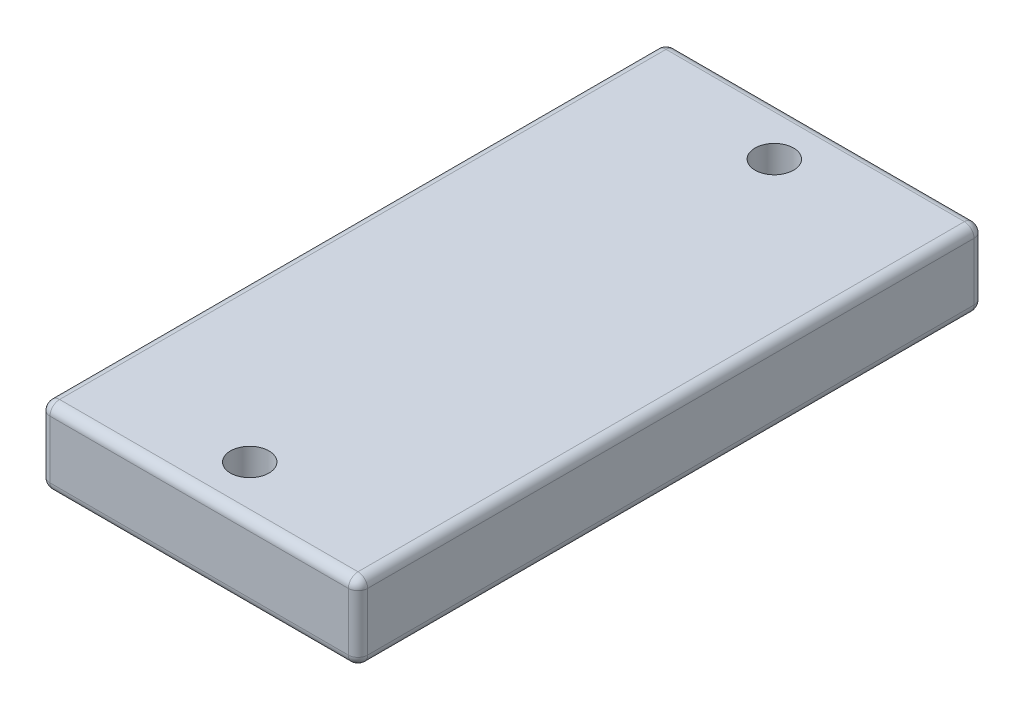
ISO-10303-21;
HEADER;
FILE_DESCRIPTION(('STEP AP214'),'2;1');
FILE_NAME('part.step','',(''),(''),'','','');
FILE_SCHEMA(('AUTOMOTIVE_DESIGN { 1 0 10303 214 1 1 1 1 }'));
ENDSEC;
DATA;
#1=APPLICATION_CONTEXT('core data for automotive mechanical design processes');
#2=APPLICATION_PROTOCOL_DEFINITION('international standard','automotive_design',2000,#1);
#3=PRODUCT_CONTEXT('',#1,'mechanical');
#4=PRODUCT('Part','Part','',(#3));
#5=PRODUCT_RELATED_PRODUCT_CATEGORY('part','',(#4));
#6=PRODUCT_DEFINITION_FORMATION('','',#4);
#7=PRODUCT_DEFINITION_CONTEXT('part definition',#1,'design');
#8=PRODUCT_DEFINITION('design','',#6,#7);
#9=PRODUCT_DEFINITION_SHAPE('','',#8);
#10=(LENGTH_UNIT() NAMED_UNIT(*) SI_UNIT(.MILLI.,.METRE.));
#11=(NAMED_UNIT(*) PLANE_ANGLE_UNIT() SI_UNIT($,.RADIAN.));
#12=(NAMED_UNIT(*) SI_UNIT($,.STERADIAN.) SOLID_ANGLE_UNIT());
#13=UNCERTAINTY_MEASURE_WITH_UNIT(LENGTH_MEASURE(1.E-05),#10,'distance_accuracy_value','');
#14=(GEOMETRIC_REPRESENTATION_CONTEXT(3) GLOBAL_UNCERTAINTY_ASSIGNED_CONTEXT((#13)) GLOBAL_UNIT_ASSIGNED_CONTEXT((#10,
#11,#12)) REPRESENTATION_CONTEXT('',''));
#15=CARTESIAN_POINT('',(0.,0.,0.));
#16=DIRECTION('',(0.,0.,1.));
#17=DIRECTION('',(1.,0.,0.));
#18=AXIS2_PLACEMENT_3D('',#15,#16,#17);
#19=CARTESIAN_POINT('',(0.,8.,0.));
#20=DIRECTION('',(1.,0.,0.));
#21=DIRECTION('',(0.,0.,-1.));
#22=AXIS2_PLACEMENT_3D('',#19,#20,#21);
#23=PLANE('',#22);
#24=DIRECTION('',(0.,-1.,0.));
#25=VECTOR('',#24,1.);
#26=CARTESIAN_POINT('',(0.,8.,-64.));
#27=LINE('',#26,#25);
#28=CARTESIAN_POINT('',(0.,7.,-64.));
#29=VERTEX_POINT('',#28);
#30=CARTESIAN_POINT('',(0.,1.,-64.));
#31=VERTEX_POINT('',#30);
#32=EDGE_CURVE('E132',#29,#31,#27,.T.);
#33=ORIENTED_EDGE('',*,*,#32,.T.);
#34=DIRECTION('',(0.,0.,1.));
#35=VECTOR('',#34,1.);
#36=CARTESIAN_POINT('',(0.,1.,0.));
#37=LINE('',#36,#35);
#38=CARTESIAN_POINT('',(0.,1.,-1.));
#39=VERTEX_POINT('',#38);
#40=EDGE_CURVE('E128',#31,#39,#37,.T.);
#41=ORIENTED_EDGE('',*,*,#40,.T.);
#42=DIRECTION('',(0.,-1.,0.));
#43=VECTOR('',#42,1.);
#44=CARTESIAN_POINT('',(0.,8.,-1.));
#45=LINE('',#44,#43);
#46=CARTESIAN_POINT('',(0.,7.,-1.));
#47=VERTEX_POINT('',#46);
#48=EDGE_CURVE('E121',#39,#47,#45,.F.);
#49=ORIENTED_EDGE('',*,*,#48,.T.);
#50=DIRECTION('',(0.,0.,1.));
#51=VECTOR('',#50,1.);
#52=CARTESIAN_POINT('',(0.,7.,0.));
#53=LINE('',#52,#51);
#54=EDGE_CURVE('E125',#47,#29,#53,.F.);
#55=ORIENTED_EDGE('',*,*,#54,.T.);
#56=EDGE_LOOP('',(#33,#41,#49,#55));
#57=FACE_BOUND('',#56,.T.);
#58=ADVANCED_FACE('F33',(#57),#23,.F.);
#59=CARTESIAN_POINT('',(0.,8.,0.));
#60=DIRECTION('',(0.,0.,-1.));
#61=DIRECTION('',(-1.,0.,0.));
#62=AXIS2_PLACEMENT_3D('',#59,#60,#61);
#63=PLANE('',#62);
#64=DIRECTION('',(0.,-1.,0.));
#65=VECTOR('',#64,1.);
#66=CARTESIAN_POINT('',(1.,8.,0.));
#67=LINE('',#66,#65);
#68=CARTESIAN_POINT('',(1.,7.,0.));
#69=VERTEX_POINT('',#68);
#70=CARTESIAN_POINT('',(1.,1.,0.));
#71=VERTEX_POINT('',#70);
#72=EDGE_CURVE('E140',#69,#71,#67,.T.);
#73=ORIENTED_EDGE('',*,*,#72,.T.);
#74=DIRECTION('',(1.,0.,0.));
#75=VECTOR('',#74,1.);
#76=CARTESIAN_POINT('',(33.,1.,0.));
#77=LINE('',#76,#75);
#78=CARTESIAN_POINT('',(32.,1.,0.));
#79=VERTEX_POINT('',#78);
#80=EDGE_CURVE('E190',#71,#79,#77,.T.);
#81=ORIENTED_EDGE('',*,*,#80,.T.);
#82=DIRECTION('',(0.,-1.,0.));
#83=VECTOR('',#82,1.);
#84=CARTESIAN_POINT('',(32.,8.,0.));
#85=LINE('',#84,#83);
#86=CARTESIAN_POINT('',(32.,7.,0.));
#87=VERTEX_POINT('',#86);
#88=EDGE_CURVE('E187',#79,#87,#85,.F.);
#89=ORIENTED_EDGE('',*,*,#88,.T.);
#90=DIRECTION('',(1.,0.,0.));
#91=VECTOR('',#90,1.);
#92=CARTESIAN_POINT('',(0.,7.,0.));
#93=LINE('',#92,#91);
#94=EDGE_CURVE('E185',#87,#69,#93,.F.);
#95=ORIENTED_EDGE('',*,*,#94,.T.);
#96=EDGE_LOOP('',(#73,#81,#89,#95));
#97=FACE_BOUND('',#96,.T.);
#98=ADVANCED_FACE('F297',(#97),#63,.F.);
#99=CARTESIAN_POINT('',(33.,8.,0.));
#100=DIRECTION('',(-1.,0.,0.));
#101=DIRECTION('',(0.,0.,1.));
#102=AXIS2_PLACEMENT_3D('',#99,#100,#101);
#103=PLANE('',#102);
#104=DIRECTION('',(0.,-1.,0.));
#105=VECTOR('',#104,1.);
#106=CARTESIAN_POINT('',(33.,8.,-1.));
#107=LINE('',#106,#105);
#108=CARTESIAN_POINT('',(33.,7.,-1.));
#109=VERTEX_POINT('',#108);
#110=CARTESIAN_POINT('',(33.,1.,-1.));
#111=VERTEX_POINT('',#110);
#112=EDGE_CURVE('E178',#109,#111,#107,.T.);
#113=ORIENTED_EDGE('',*,*,#112,.T.);
#114=DIRECTION('',(0.,0.,-1.));
#115=VECTOR('',#114,1.);
#116=CARTESIAN_POINT('',(33.,1.,-65.));
#117=LINE('',#116,#115);
#118=CARTESIAN_POINT('',(33.,1.,-64.));
#119=VERTEX_POINT('',#118);
#120=EDGE_CURVE('E183',#111,#119,#117,.T.);
#121=ORIENTED_EDGE('',*,*,#120,.T.);
#122=DIRECTION('',(0.,-1.,0.));
#123=VECTOR('',#122,1.);
#124=CARTESIAN_POINT('',(33.,8.,-64.));
#125=LINE('',#124,#123);
#126=CARTESIAN_POINT('',(33.,7.,-64.));
#127=VERTEX_POINT('',#126);
#128=EDGE_CURVE('E180',#119,#127,#125,.F.);
#129=ORIENTED_EDGE('',*,*,#128,.T.);
#130=DIRECTION('',(0.,0.,-1.));
#131=VECTOR('',#130,1.);
#132=CARTESIAN_POINT('',(33.,7.,0.));
#133=LINE('',#132,#131);
#134=EDGE_CURVE('E176',#127,#109,#133,.F.);
#135=ORIENTED_EDGE('',*,*,#134,.T.);
#136=EDGE_LOOP('',(#113,#121,#129,#135));
#137=FACE_BOUND('',#136,.T.);
#138=ADVANCED_FACE('F276',(#137),#103,.F.);
#139=CARTESIAN_POINT('',(0.,8.,-65.));
#140=DIRECTION('',(0.,0.,1.));
#141=DIRECTION('',(1.,0.,0.));
#142=AXIS2_PLACEMENT_3D('',#139,#140,#141);
#143=PLANE('',#142);
#144=DIRECTION('',(0.,-1.,0.));
#145=VECTOR('',#144,1.);
#146=CARTESIAN_POINT('',(32.,8.,-65.));
#147=LINE('',#146,#145);
#148=CARTESIAN_POINT('',(32.,7.,-65.));
#149=VERTEX_POINT('',#148);
#150=CARTESIAN_POINT('',(32.,1.,-65.));
#151=VERTEX_POINT('',#150);
#152=EDGE_CURVE('E169',#149,#151,#147,.T.);
#153=ORIENTED_EDGE('',*,*,#152,.T.);
#154=DIRECTION('',(-1.,0.,0.));
#155=VECTOR('',#154,1.);
#156=CARTESIAN_POINT('',(0.,1.,-65.));
#157=LINE('',#156,#155);
#158=CARTESIAN_POINT('',(1.,1.,-65.));
#159=VERTEX_POINT('',#158);
#160=EDGE_CURVE('E174',#151,#159,#157,.T.);
#161=ORIENTED_EDGE('',*,*,#160,.T.);
#162=DIRECTION('',(0.,-1.,0.));
#163=VECTOR('',#162,1.);
#164=CARTESIAN_POINT('',(1.,8.,-65.));
#165=LINE('',#164,#163);
#166=CARTESIAN_POINT('',(1.,7.,-65.));
#167=VERTEX_POINT('',#166);
#168=EDGE_CURVE('E171',#159,#167,#165,.F.);
#169=ORIENTED_EDGE('',*,*,#168,.T.);
#170=DIRECTION('',(-1.,0.,0.));
#171=VECTOR('',#170,1.);
#172=CARTESIAN_POINT('',(0.,7.,-65.));
#173=LINE('',#172,#171);
#174=EDGE_CURVE('E167',#167,#149,#173,.F.);
#175=ORIENTED_EDGE('',*,*,#174,.T.);
#176=EDGE_LOOP('',(#153,#161,#169,#175));
#177=FACE_BOUND('',#176,.T.);
#178=ADVANCED_FACE('F304',(#177),#143,.F.);
#179=CARTESIAN_POINT('',(0.,8.,0.));
#180=DIRECTION('',(0.,-1.,0.));
#181=DIRECTION('',(0.,0.,-1.));
#182=AXIS2_PLACEMENT_3D('',#179,#180,#181);
#183=PLANE('',#182);
#184=CARTESIAN_POINT('',(16.5,8.,-5.24999999999999));
#185=DIRECTION('',(0.,1.,0.));
#186=DIRECTION('',(0.,0.,1.));
#187=AXIS2_PLACEMENT_3D('',#184,#185,#186);
#188=CIRCLE('',#187,2.);
#189=CARTESIAN_POINT('',(16.5,8.,-3.24999999999999));
#190=VERTEX_POINT('',#189);
#191=EDGE_CURVE('E435',#190,#190,#188,.T.);
#192=ORIENTED_EDGE('',*,*,#191,.F.);
#193=EDGE_LOOP('',(#192));
#194=FACE_BOUND('',#193,.T.);
#195=CARTESIAN_POINT('',(16.5,8.,-59.75));
#196=DIRECTION('',(0.,1.,0.));
#197=DIRECTION('',(0.,0.,1.));
#198=AXIS2_PLACEMENT_3D('',#195,#196,#197);
#199=CIRCLE('',#198,2.);
#200=CARTESIAN_POINT('',(16.5,8.,-57.75));
#201=VERTEX_POINT('',#200);
#202=EDGE_CURVE('E162',#201,#201,#199,.T.);
#203=ORIENTED_EDGE('',*,*,#202,.F.);
#204=EDGE_LOOP('',(#203));
#205=FACE_BOUND('',#204,.T.);
#206=DIRECTION('',(0.,0.,-1.));
#207=VECTOR('',#206,1.);
#208=CARTESIAN_POINT('',(32.,8.,0.));
#209=LINE('',#208,#207);
#210=CARTESIAN_POINT('',(32.,8.,-1.));
#211=VERTEX_POINT('',#210);
#212=CARTESIAN_POINT('',(32.,8.,-64.));
#213=VERTEX_POINT('',#212);
#214=EDGE_CURVE('E42',#211,#213,#209,.T.);
#215=ORIENTED_EDGE('',*,*,#214,.T.);
#216=DIRECTION('',(-1.,0.,0.));
#217=VECTOR('',#216,1.);
#218=CARTESIAN_POINT('',(0.,8.,-64.));
#219=LINE('',#218,#217);
#220=CARTESIAN_POINT('',(1.,8.,-64.));
#221=VERTEX_POINT('',#220);
#222=EDGE_CURVE('E11',#213,#221,#219,.T.);
#223=ORIENTED_EDGE('',*,*,#222,.T.);
#224=DIRECTION('',(0.,0.,1.));
#225=VECTOR('',#224,1.);
#226=CARTESIAN_POINT('',(1.,8.,0.));
#227=LINE('',#226,#225);
#228=CARTESIAN_POINT('',(1.,8.,-1.));
#229=VERTEX_POINT('',#228);
#230=EDGE_CURVE('E201',#221,#229,#227,.T.);
#231=ORIENTED_EDGE('',*,*,#230,.T.);
#232=DIRECTION('',(1.,0.,0.));
#233=VECTOR('',#232,1.);
#234=CARTESIAN_POINT('',(0.,8.,-1.));
#235=LINE('',#234,#233);
#236=EDGE_CURVE('E53',#229,#211,#235,.T.);
#237=ORIENTED_EDGE('',*,*,#236,.T.);
#238=EDGE_LOOP('',(#215,#223,#231,#237));
#239=FACE_BOUND('',#238,.T.);
#240=ADVANCED_FACE('F369',(#194,#205,#239),#183,.F.);
#241=CARTESIAN_POINT('',(0.,0.,0.));
#242=DIRECTION('',(0.,-1.,0.));
#243=DIRECTION('',(0.,0.,-1.));
#244=AXIS2_PLACEMENT_3D('',#241,#242,#243);
#245=PLANE('',#244);
#246=CARTESIAN_POINT('',(16.5,0.,-5.24999999999999));
#247=DIRECTION('',(0.,1.,0.));
#248=DIRECTION('',(0.,0.,1.));
#249=AXIS2_PLACEMENT_3D('',#246,#247,#248);
#250=CIRCLE('',#249,2.);
#251=CARTESIAN_POINT('',(16.5,0.,-3.24999999999999));
#252=VERTEX_POINT('',#251);
#253=EDGE_CURVE('E208',#252,#252,#250,.T.);
#254=ORIENTED_EDGE('',*,*,#253,.T.);
#255=EDGE_LOOP('',(#254));
#256=FACE_BOUND('',#255,.T.);
#257=CARTESIAN_POINT('',(16.5,0.,-59.75));
#258=DIRECTION('',(0.,1.,0.));
#259=DIRECTION('',(0.,0.,1.));
#260=AXIS2_PLACEMENT_3D('',#257,#258,#259);
#261=CIRCLE('',#260,2.);
#262=CARTESIAN_POINT('',(16.5,0.,-57.75));
#263=VERTEX_POINT('',#262);
#264=EDGE_CURVE('E436',#263,#263,#261,.T.);
#265=ORIENTED_EDGE('',*,*,#264,.T.);
#266=EDGE_LOOP('',(#265));
#267=FACE_BOUND('',#266,.T.);
#268=DIRECTION('',(0.,0.,-1.));
#269=VECTOR('',#268,1.);
#270=CARTESIAN_POINT('',(32.,0.,0.));
#271=LINE('',#270,#269);
#272=CARTESIAN_POINT('',(32.,0.,-64.));
#273=VERTEX_POINT('',#272);
#274=CARTESIAN_POINT('',(32.,0.,-1.));
#275=VERTEX_POINT('',#274);
#276=EDGE_CURVE('E196',#273,#275,#271,.F.);
#277=ORIENTED_EDGE('',*,*,#276,.T.);
#278=DIRECTION('',(1.,0.,0.));
#279=VECTOR('',#278,1.);
#280=CARTESIAN_POINT('',(0.,0.,-1.));
#281=LINE('',#280,#279);
#282=CARTESIAN_POINT('',(1.,0.,-1.));
#283=VERTEX_POINT('',#282);
#284=EDGE_CURVE('E198',#275,#283,#281,.F.);
#285=ORIENTED_EDGE('',*,*,#284,.T.);
#286=DIRECTION('',(0.,0.,1.));
#287=VECTOR('',#286,1.);
#288=CARTESIAN_POINT('',(1.,0.,-65.));
#289=LINE('',#288,#287);
#290=CARTESIAN_POINT('',(1.,0.,-64.));
#291=VERTEX_POINT('',#290);
#292=EDGE_CURVE('E192',#283,#291,#289,.F.);
#293=ORIENTED_EDGE('',*,*,#292,.T.);
#294=DIRECTION('',(-1.,0.,0.));
#295=VECTOR('',#294,1.);
#296=CARTESIAN_POINT('',(33.,0.,-64.));
#297=LINE('',#296,#295);
#298=EDGE_CURVE('E194',#291,#273,#297,.F.);
#299=ORIENTED_EDGE('',*,*,#298,.T.);
#300=EDGE_LOOP('',(#277,#285,#293,#299));
#301=FACE_BOUND('',#300,.T.);
#302=ADVANCED_FACE('F268',(#256,#267,#301),#245,.T.);
#303=CARTESIAN_POINT('',(32.,8.,-1.));
#304=DIRECTION('',(0.,-1.,0.));
#305=DIRECTION('',(0.,0.,-1.));
#306=AXIS2_PLACEMENT_3D('',#303,#304,#305);
#307=CYLINDRICAL_SURFACE('',#306,1.);
#308=CARTESIAN_POINT('',(32.,7.,-1.));
#309=DIRECTION('',(0.,1.,0.));
#310=DIRECTION('',(0.,0.,1.));
#311=AXIS2_PLACEMENT_3D('',#308,#309,#310);
#312=CIRCLE('',#311,1.);
#313=EDGE_CURVE('E37',#87,#109,#312,.T.);
#314=ORIENTED_EDGE('',*,*,#313,.F.);
#315=ORIENTED_EDGE('',*,*,#88,.F.);
#316=CARTESIAN_POINT('',(32.,1.,-1.));
#317=DIRECTION('',(0.,-1.,0.));
#318=DIRECTION('',(0.,0.,-1.));
#319=AXIS2_PLACEMENT_3D('',#316,#317,#318);
#320=CIRCLE('',#319,1.);
#321=EDGE_CURVE('E160',#111,#79,#320,.T.);
#322=ORIENTED_EDGE('',*,*,#321,.F.);
#323=ORIENTED_EDGE('',*,*,#112,.F.);
#324=EDGE_LOOP('',(#314,#315,#322,#323));
#325=FACE_BOUND('',#324,.T.);
#326=ADVANCED_FACE('F35',(#325),#307,.T.);
#327=CARTESIAN_POINT('',(32.,7.,-1.));
#328=DIRECTION('',(0.,0.,1.));
#329=DIRECTION('',(1.,0.,0.));
#330=AXIS2_PLACEMENT_3D('',#327,#328,#329);
#331=SPHERICAL_SURFACE('',#330,1.);
#332=CARTESIAN_POINT('',(32.,7.,-1.));
#333=DIRECTION('',(1.,0.,0.));
#334=DIRECTION('',(0.,0.,-1.));
#335=AXIS2_PLACEMENT_3D('',#332,#333,#334);
#336=CIRCLE('',#335,1.);
#337=EDGE_CURVE('E248',#87,#211,#336,.F.);
#338=ORIENTED_EDGE('',*,*,#337,.F.);
#339=ORIENTED_EDGE('',*,*,#313,.T.);
#340=CARTESIAN_POINT('',(32.,7.,-1.));
#341=DIRECTION('',(0.,0.,1.));
#342=DIRECTION('',(1.,0.,0.));
#343=AXIS2_PLACEMENT_3D('',#340,#341,#342);
#344=CIRCLE('',#343,1.);
#345=EDGE_CURVE('E250',#211,#109,#344,.F.);
#346=ORIENTED_EDGE('',*,*,#345,.F.);
#347=EDGE_LOOP('',(#338,#339,#346));
#348=FACE_BOUND('',#347,.T.);
#349=ADVANCED_FACE('F292',(#348),#331,.T.);
#350=CARTESIAN_POINT('',(32.,1.,-1.));
#351=DIRECTION('',(0.,0.,1.));
#352=DIRECTION('',(1.,0.,0.));
#353=AXIS2_PLACEMENT_3D('',#350,#351,#352);
#354=SPHERICAL_SURFACE('',#353,1.);
#355=CARTESIAN_POINT('',(32.,1.,-1.));
#356=DIRECTION('',(0.,0.,1.));
#357=DIRECTION('',(1.,0.,0.));
#358=AXIS2_PLACEMENT_3D('',#355,#356,#357);
#359=CIRCLE('',#358,1.);
#360=EDGE_CURVE('E242',#111,#275,#359,.F.);
#361=ORIENTED_EDGE('',*,*,#360,.F.);
#362=ORIENTED_EDGE('',*,*,#321,.T.);
#363=CARTESIAN_POINT('',(32.,1.,-1.));
#364=DIRECTION('',(1.,0.,0.));
#365=DIRECTION('',(0.,0.,-1.));
#366=AXIS2_PLACEMENT_3D('',#363,#364,#365);
#367=CIRCLE('',#366,1.);
#368=EDGE_CURVE('E245',#275,#79,#367,.F.);
#369=ORIENTED_EDGE('',*,*,#368,.F.);
#370=EDGE_LOOP('',(#361,#362,#369));
#371=FACE_BOUND('',#370,.T.);
#372=ADVANCED_FACE('F257',(#371),#354,.T.);
#373=CARTESIAN_POINT('',(32.,7.,0.));
#374=DIRECTION('',(0.,0.,-1.));
#375=DIRECTION('',(-1.,0.,0.));
#376=AXIS2_PLACEMENT_3D('',#373,#374,#375);
#377=CYLINDRICAL_SURFACE('',#376,1.);
#378=ORIENTED_EDGE('',*,*,#345,.T.);
#379=ORIENTED_EDGE('',*,*,#134,.F.);
#380=CARTESIAN_POINT('',(32.,7.,-64.));
#381=DIRECTION('',(0.,0.,-1.));
#382=DIRECTION('',(-1.,0.,0.));
#383=AXIS2_PLACEMENT_3D('',#380,#381,#382);
#384=CIRCLE('',#383,1.);
#385=EDGE_CURVE('E237',#213,#127,#384,.T.);
#386=ORIENTED_EDGE('',*,*,#385,.F.);
#387=ORIENTED_EDGE('',*,*,#214,.F.);
#388=EDGE_LOOP('',(#378,#379,#386,#387));
#389=FACE_BOUND('',#388,.T.);
#390=ADVANCED_FACE('F287',(#389),#377,.T.);
#391=CARTESIAN_POINT('',(0.,7.,-1.));
#392=DIRECTION('',(1.,0.,0.));
#393=DIRECTION('',(0.,0.,-1.));
#394=AXIS2_PLACEMENT_3D('',#391,#392,#393);
#395=CYLINDRICAL_SURFACE('',#394,1.);
#396=ORIENTED_EDGE('',*,*,#337,.T.);
#397=ORIENTED_EDGE('',*,*,#236,.F.);
#398=CARTESIAN_POINT('',(1.,7.,-1.));
#399=DIRECTION('',(-1.,0.,0.));
#400=DIRECTION('',(0.,0.,1.));
#401=AXIS2_PLACEMENT_3D('',#398,#399,#400);
#402=CIRCLE('',#401,1.);
#403=EDGE_CURVE('E144',#69,#229,#402,.T.);
#404=ORIENTED_EDGE('',*,*,#403,.F.);
#405=ORIENTED_EDGE('',*,*,#94,.F.);
#406=EDGE_LOOP('',(#396,#397,#404,#405));
#407=FACE_BOUND('',#406,.T.);
#408=ADVANCED_FACE('F295',(#407),#395,.T.);
#409=CARTESIAN_POINT('',(1.,8.,-1.));
#410=DIRECTION('',(0.,-1.,0.));
#411=DIRECTION('',(0.,0.,-1.));
#412=AXIS2_PLACEMENT_3D('',#409,#410,#411);
#413=CYLINDRICAL_SURFACE('',#412,1.);
#414=CARTESIAN_POINT('',(1.,1.,-1.));
#415=DIRECTION('',(0.,-1.,0.));
#416=DIRECTION('',(0.,0.,-1.));
#417=AXIS2_PLACEMENT_3D('',#414,#415,#416);
#418=CIRCLE('',#417,1.);
#419=EDGE_CURVE('E145',#71,#39,#418,.T.);
#420=ORIENTED_EDGE('',*,*,#419,.F.);
#421=ORIENTED_EDGE('',*,*,#72,.F.);
#422=CARTESIAN_POINT('',(1.,7.,-1.));
#423=DIRECTION('',(0.,1.,0.));
#424=DIRECTION('',(0.,0.,1.));
#425=AXIS2_PLACEMENT_3D('',#422,#423,#424);
#426=CIRCLE('',#425,1.);
#427=EDGE_CURVE('E136',#47,#69,#426,.T.);
#428=ORIENTED_EDGE('',*,*,#427,.F.);
#429=ORIENTED_EDGE('',*,*,#48,.F.);
#430=EDGE_LOOP('',(#420,#421,#428,#429));
#431=FACE_BOUND('',#430,.T.);
#432=ADVANCED_FACE('F138',(#431),#413,.T.);
#433=CARTESIAN_POINT('',(0.,1.,-1.));
#434=DIRECTION('',(-1.,0.,0.));
#435=DIRECTION('',(0.,0.,1.));
#436=AXIS2_PLACEMENT_3D('',#433,#434,#435);
#437=CYLINDRICAL_SURFACE('',#436,1.);
#438=ORIENTED_EDGE('',*,*,#368,.T.);
#439=ORIENTED_EDGE('',*,*,#80,.F.);
#440=CARTESIAN_POINT('',(1.,1.,-1.));
#441=DIRECTION('',(-1.,0.,0.));
#442=DIRECTION('',(0.,0.,1.));
#443=AXIS2_PLACEMENT_3D('',#440,#441,#442);
#444=CIRCLE('',#443,1.);
#445=EDGE_CURVE('E233',#283,#71,#444,.T.);
#446=ORIENTED_EDGE('',*,*,#445,.F.);
#447=ORIENTED_EDGE('',*,*,#284,.F.);
#448=EDGE_LOOP('',(#438,#439,#446,#447));
#449=FACE_BOUND('',#448,.T.);
#450=ADVANCED_FACE('F265',(#449),#437,.T.);
#451=CARTESIAN_POINT('',(32.,1.,0.));
#452=DIRECTION('',(0.,0.,1.));
#453=DIRECTION('',(1.,0.,0.));
#454=AXIS2_PLACEMENT_3D('',#451,#452,#453);
#455=CYLINDRICAL_SURFACE('',#454,1.);
#456=ORIENTED_EDGE('',*,*,#360,.T.);
#457=ORIENTED_EDGE('',*,*,#276,.F.);
#458=CARTESIAN_POINT('',(32.,1.,-64.));
#459=DIRECTION('',(0.,0.,-1.));
#460=DIRECTION('',(-1.,0.,0.));
#461=AXIS2_PLACEMENT_3D('',#458,#459,#460);
#462=CIRCLE('',#461,1.);
#463=EDGE_CURVE('E230',#119,#273,#462,.T.);
#464=ORIENTED_EDGE('',*,*,#463,.F.);
#465=ORIENTED_EDGE('',*,*,#120,.F.);
#466=EDGE_LOOP('',(#456,#457,#464,#465));
#467=FACE_BOUND('',#466,.T.);
#468=ADVANCED_FACE('F273',(#467),#455,.T.);
#469=CARTESIAN_POINT('',(32.,8.,-64.));
#470=DIRECTION('',(0.,-1.,0.));
#471=DIRECTION('',(0.,0.,-1.));
#472=AXIS2_PLACEMENT_3D('',#469,#470,#471);
#473=CYLINDRICAL_SURFACE('',#472,1.);
#474=CARTESIAN_POINT('',(32.,7.,-64.));
#475=DIRECTION('',(0.,1.,0.));
#476=DIRECTION('',(0.,0.,1.));
#477=AXIS2_PLACEMENT_3D('',#474,#475,#476);
#478=CIRCLE('',#477,1.);
#479=EDGE_CURVE('E239',#127,#149,#478,.T.);
#480=ORIENTED_EDGE('',*,*,#479,.F.);
#481=ORIENTED_EDGE('',*,*,#128,.F.);
#482=CARTESIAN_POINT('',(32.,1.,-64.));
#483=DIRECTION('',(0.,-1.,0.));
#484=DIRECTION('',(0.,0.,-1.));
#485=AXIS2_PLACEMENT_3D('',#482,#483,#484);
#486=CIRCLE('',#485,1.);
#487=EDGE_CURVE('E227',#151,#119,#486,.T.);
#488=ORIENTED_EDGE('',*,*,#487,.F.);
#489=ORIENTED_EDGE('',*,*,#152,.F.);
#490=EDGE_LOOP('',(#480,#481,#488,#489));
#491=FACE_BOUND('',#490,.T.);
#492=ADVANCED_FACE('F280',(#491),#473,.T.);
#493=CARTESIAN_POINT('',(32.,7.,-64.));
#494=DIRECTION('',(0.,0.,1.));
#495=DIRECTION('',(1.,0.,0.));
#496=AXIS2_PLACEMENT_3D('',#493,#494,#495);
#497=SPHERICAL_SURFACE('',#496,1.);
#498=ORIENTED_EDGE('',*,*,#385,.T.);
#499=ORIENTED_EDGE('',*,*,#479,.T.);
#500=CARTESIAN_POINT('',(32.,7.,-64.));
#501=DIRECTION('',(1.,0.,0.));
#502=DIRECTION('',(0.,0.,-1.));
#503=AXIS2_PLACEMENT_3D('',#500,#501,#502);
#504=CIRCLE('',#503,1.);
#505=EDGE_CURVE('E152',#213,#149,#504,.F.);
#506=ORIENTED_EDGE('',*,*,#505,.F.);
#507=EDGE_LOOP('',(#498,#499,#506));
#508=FACE_BOUND('',#507,.T.);
#509=ADVANCED_FACE('F346',(#508),#497,.T.);
#510=CARTESIAN_POINT('',(1.,7.,-1.));
#511=DIRECTION('',(0.,0.,1.));
#512=DIRECTION('',(1.,0.,0.));
#513=AXIS2_PLACEMENT_3D('',#510,#511,#512);
#514=SPHERICAL_SURFACE('',#513,1.);
#515=ORIENTED_EDGE('',*,*,#427,.T.);
#516=ORIENTED_EDGE('',*,*,#403,.T.);
#517=CARTESIAN_POINT('',(1.,7.,-1.));
#518=DIRECTION('',(0.,0.,1.));
#519=DIRECTION('',(1.,0.,0.));
#520=AXIS2_PLACEMENT_3D('',#517,#518,#519);
#521=CIRCLE('',#520,1.);
#522=EDGE_CURVE('E148',#47,#229,#521,.F.);
#523=ORIENTED_EDGE('',*,*,#522,.F.);
#524=EDGE_LOOP('',(#515,#516,#523));
#525=FACE_BOUND('',#524,.T.);
#526=ADVANCED_FACE('F149',(#525),#514,.T.);
#527=CARTESIAN_POINT('',(1.,1.,-1.));
#528=DIRECTION('',(0.,0.,1.));
#529=DIRECTION('',(1.,0.,0.));
#530=AXIS2_PLACEMENT_3D('',#527,#528,#529);
#531=SPHERICAL_SURFACE('',#530,1.);
#532=ORIENTED_EDGE('',*,*,#445,.T.);
#533=ORIENTED_EDGE('',*,*,#419,.T.);
#534=CARTESIAN_POINT('',(1.,1.,-1.));
#535=DIRECTION('',(0.,0.,1.));
#536=DIRECTION('',(1.,0.,0.));
#537=AXIS2_PLACEMENT_3D('',#534,#535,#536);
#538=CIRCLE('',#537,1.);
#539=EDGE_CURVE('E153',#283,#39,#538,.F.);
#540=ORIENTED_EDGE('',*,*,#539,.F.);
#541=EDGE_LOOP('',(#532,#533,#540));
#542=FACE_BOUND('',#541,.T.);
#543=ADVANCED_FACE('F339',(#542),#531,.T.);
#544=CARTESIAN_POINT('',(32.,1.,-64.));
#545=DIRECTION('',(0.,0.,1.));
#546=DIRECTION('',(1.,0.,0.));
#547=AXIS2_PLACEMENT_3D('',#544,#545,#546);
#548=SPHERICAL_SURFACE('',#547,1.);
#549=ORIENTED_EDGE('',*,*,#487,.T.);
#550=ORIENTED_EDGE('',*,*,#463,.T.);
#551=CARTESIAN_POINT('',(32.,1.,-64.));
#552=DIRECTION('',(1.,0.,0.));
#553=DIRECTION('',(0.,0.,-1.));
#554=AXIS2_PLACEMENT_3D('',#551,#552,#553);
#555=CIRCLE('',#554,1.);
#556=EDGE_CURVE('E220',#151,#273,#555,.F.);
#557=ORIENTED_EDGE('',*,*,#556,.F.);
#558=EDGE_LOOP('',(#549,#550,#557));
#559=FACE_BOUND('',#558,.T.);
#560=ADVANCED_FACE('F335',(#559),#548,.T.);
#561=CARTESIAN_POINT('',(0.,7.,-64.));
#562=DIRECTION('',(-1.,0.,0.));
#563=DIRECTION('',(0.,0.,1.));
#564=AXIS2_PLACEMENT_3D('',#561,#562,#563);
#565=CYLINDRICAL_SURFACE('',#564,1.);
#566=ORIENTED_EDGE('',*,*,#505,.T.);
#567=ORIENTED_EDGE('',*,*,#174,.F.);
#568=CARTESIAN_POINT('',(1.,7.,-64.));
#569=DIRECTION('',(-1.,0.,0.));
#570=DIRECTION('',(0.,0.,1.));
#571=AXIS2_PLACEMENT_3D('',#568,#569,#570);
#572=CIRCLE('',#571,1.);
#573=EDGE_CURVE('E217',#221,#167,#572,.T.);
#574=ORIENTED_EDGE('',*,*,#573,.F.);
#575=ORIENTED_EDGE('',*,*,#222,.F.);
#576=EDGE_LOOP('',(#566,#567,#574,#575));
#577=FACE_BOUND('',#576,.T.);
#578=ADVANCED_FACE('F332',(#577),#565,.T.);
#579=CARTESIAN_POINT('',(1.,7.,0.));
#580=DIRECTION('',(0.,0.,1.));
#581=DIRECTION('',(1.,0.,0.));
#582=AXIS2_PLACEMENT_3D('',#579,#580,#581);
#583=CYLINDRICAL_SURFACE('',#582,1.);
#584=ORIENTED_EDGE('',*,*,#522,.T.);
#585=ORIENTED_EDGE('',*,*,#230,.F.);
#586=CARTESIAN_POINT('',(1.,7.,-64.));
#587=DIRECTION('',(0.,0.,-1.));
#588=DIRECTION('',(-1.,0.,0.));
#589=AXIS2_PLACEMENT_3D('',#586,#587,#588);
#590=CIRCLE('',#589,1.);
#591=EDGE_CURVE('E156',#29,#221,#590,.T.);
#592=ORIENTED_EDGE('',*,*,#591,.F.);
#593=ORIENTED_EDGE('',*,*,#54,.F.);
#594=EDGE_LOOP('',(#584,#585,#592,#593));
#595=FACE_BOUND('',#594,.T.);
#596=ADVANCED_FACE('F155',(#595),#583,.T.);
#597=CARTESIAN_POINT('',(1.,1.,0.));
#598=DIRECTION('',(0.,0.,-1.));
#599=DIRECTION('',(-1.,0.,0.));
#600=AXIS2_PLACEMENT_3D('',#597,#598,#599);
#601=CYLINDRICAL_SURFACE('',#600,1.);
#602=ORIENTED_EDGE('',*,*,#539,.T.);
#603=ORIENTED_EDGE('',*,*,#40,.F.);
#604=CARTESIAN_POINT('',(1.,1.,-64.));
#605=DIRECTION('',(0.,0.,-1.));
#606=DIRECTION('',(-1.,0.,0.));
#607=AXIS2_PLACEMENT_3D('',#604,#605,#606);
#608=CIRCLE('',#607,1.);
#609=EDGE_CURVE('E213',#291,#31,#608,.T.);
#610=ORIENTED_EDGE('',*,*,#609,.F.);
#611=ORIENTED_EDGE('',*,*,#292,.F.);
#612=EDGE_LOOP('',(#602,#603,#610,#611));
#613=FACE_BOUND('',#612,.T.);
#614=ADVANCED_FACE('F325',(#613),#601,.T.);
#615=CARTESIAN_POINT('',(0.,1.,-64.));
#616=DIRECTION('',(1.,0.,0.));
#617=DIRECTION('',(0.,0.,-1.));
#618=AXIS2_PLACEMENT_3D('',#615,#616,#617);
#619=CYLINDRICAL_SURFACE('',#618,1.);
#620=ORIENTED_EDGE('',*,*,#556,.T.);
#621=ORIENTED_EDGE('',*,*,#298,.F.);
#622=CARTESIAN_POINT('',(1.,1.,-64.));
#623=DIRECTION('',(-1.,0.,0.));
#624=DIRECTION('',(0.,0.,1.));
#625=AXIS2_PLACEMENT_3D('',#622,#623,#624);
#626=CIRCLE('',#625,1.);
#627=EDGE_CURVE('E210',#159,#291,#626,.T.);
#628=ORIENTED_EDGE('',*,*,#627,.F.);
#629=ORIENTED_EDGE('',*,*,#160,.F.);
#630=EDGE_LOOP('',(#620,#621,#628,#629));
#631=FACE_BOUND('',#630,.T.);
#632=ADVANCED_FACE('F321',(#631),#619,.T.);
#633=CARTESIAN_POINT('',(1.,7.,-64.));
#634=DIRECTION('',(0.,0.,1.));
#635=DIRECTION('',(1.,0.,0.));
#636=AXIS2_PLACEMENT_3D('',#633,#634,#635);
#637=SPHERICAL_SURFACE('',#636,1.);
#638=ORIENTED_EDGE('',*,*,#591,.T.);
#639=ORIENTED_EDGE('',*,*,#573,.T.);
#640=CARTESIAN_POINT('',(1.,7.,-64.));
#641=DIRECTION('',(0.,1.,0.));
#642=DIRECTION('',(0.,0.,1.));
#643=AXIS2_PLACEMENT_3D('',#640,#641,#642);
#644=CIRCLE('',#643,1.);
#645=EDGE_CURVE('E207',#29,#167,#644,.F.);
#646=ORIENTED_EDGE('',*,*,#645,.F.);
#647=EDGE_LOOP('',(#638,#639,#646));
#648=FACE_BOUND('',#647,.T.);
#649=ADVANCED_FACE('F317',(#648),#637,.T.);
#650=CARTESIAN_POINT('',(1.,1.,-64.));
#651=DIRECTION('',(0.,0.,1.));
#652=DIRECTION('',(1.,0.,0.));
#653=AXIS2_PLACEMENT_3D('',#650,#651,#652);
#654=SPHERICAL_SURFACE('',#653,1.);
#655=ORIENTED_EDGE('',*,*,#627,.T.);
#656=ORIENTED_EDGE('',*,*,#609,.T.);
#657=CARTESIAN_POINT('',(1.,1.,-64.));
#658=DIRECTION('',(0.,-1.,0.));
#659=DIRECTION('',(0.,0.,-1.));
#660=AXIS2_PLACEMENT_3D('',#657,#658,#659);
#661=CIRCLE('',#660,1.);
#662=EDGE_CURVE('E205',#159,#31,#661,.F.);
#663=ORIENTED_EDGE('',*,*,#662,.F.);
#664=EDGE_LOOP('',(#655,#656,#663));
#665=FACE_BOUND('',#664,.T.);
#666=ADVANCED_FACE('F313',(#665),#654,.T.);
#667=CARTESIAN_POINT('',(1.,8.,-64.));
#668=DIRECTION('',(0.,-1.,0.));
#669=DIRECTION('',(0.,0.,-1.));
#670=AXIS2_PLACEMENT_3D('',#667,#668,#669);
#671=CYLINDRICAL_SURFACE('',#670,1.);
#672=ORIENTED_EDGE('',*,*,#645,.T.);
#673=ORIENTED_EDGE('',*,*,#168,.F.);
#674=ORIENTED_EDGE('',*,*,#662,.T.);
#675=ORIENTED_EDGE('',*,*,#32,.F.);
#676=EDGE_LOOP('',(#672,#673,#674,#675));
#677=FACE_BOUND('',#676,.T.);
#678=ADVANCED_FACE('F309',(#677),#671,.T.);
#679=CARTESIAN_POINT('',(16.5,0.,-59.75));
#680=DIRECTION('',(0.,1.,0.));
#681=DIRECTION('',(0.,0.,1.));
#682=AXIS2_PLACEMENT_3D('',#679,#680,#681);
#683=CYLINDRICAL_SURFACE('',#682,2.);
#684=ORIENTED_EDGE('',*,*,#264,.F.);
#685=EDGE_LOOP('',(#684));
#686=FACE_BOUND('',#685,.T.);
#687=ORIENTED_EDGE('',*,*,#202,.T.);
#688=EDGE_LOOP('',(#687));
#689=FACE_BOUND('',#688,.T.);
#690=ADVANCED_FACE('F312',(#686,#689),#683,.F.);
#691=CARTESIAN_POINT('',(16.5,0.,-5.24999999999999));
#692=DIRECTION('',(0.,1.,0.));
#693=DIRECTION('',(0.,0.,1.));
#694=AXIS2_PLACEMENT_3D('',#691,#692,#693);
#695=CYLINDRICAL_SURFACE('',#694,2.);
#696=ORIENTED_EDGE('',*,*,#253,.F.);
#697=EDGE_LOOP('',(#696));
#698=FACE_BOUND('',#697,.T.);
#699=ORIENTED_EDGE('',*,*,#191,.T.);
#700=EDGE_LOOP('',(#699));
#701=FACE_BOUND('',#700,.T.);
#702=ADVANCED_FACE('F418',(#698,#701),#695,.F.);
#703=CLOSED_SHELL('',(#58,#98,#138,#178,#240,#302,#326,#349,#372,#390,#408,#432,#450,#468,#492,
#509,#526,#543,#560,#578,#596,#614,#632,#649,#666,#678,#690,#702));
#704=MANIFOLD_SOLID_BREP('B2',#703);
#705=ADVANCED_BREP_SHAPE_REPRESENTATION('',(#18,#704),#14);
#706=SHAPE_DEFINITION_REPRESENTATION(#9,#705);
ENDSEC;
END-ISO-10303-21;
